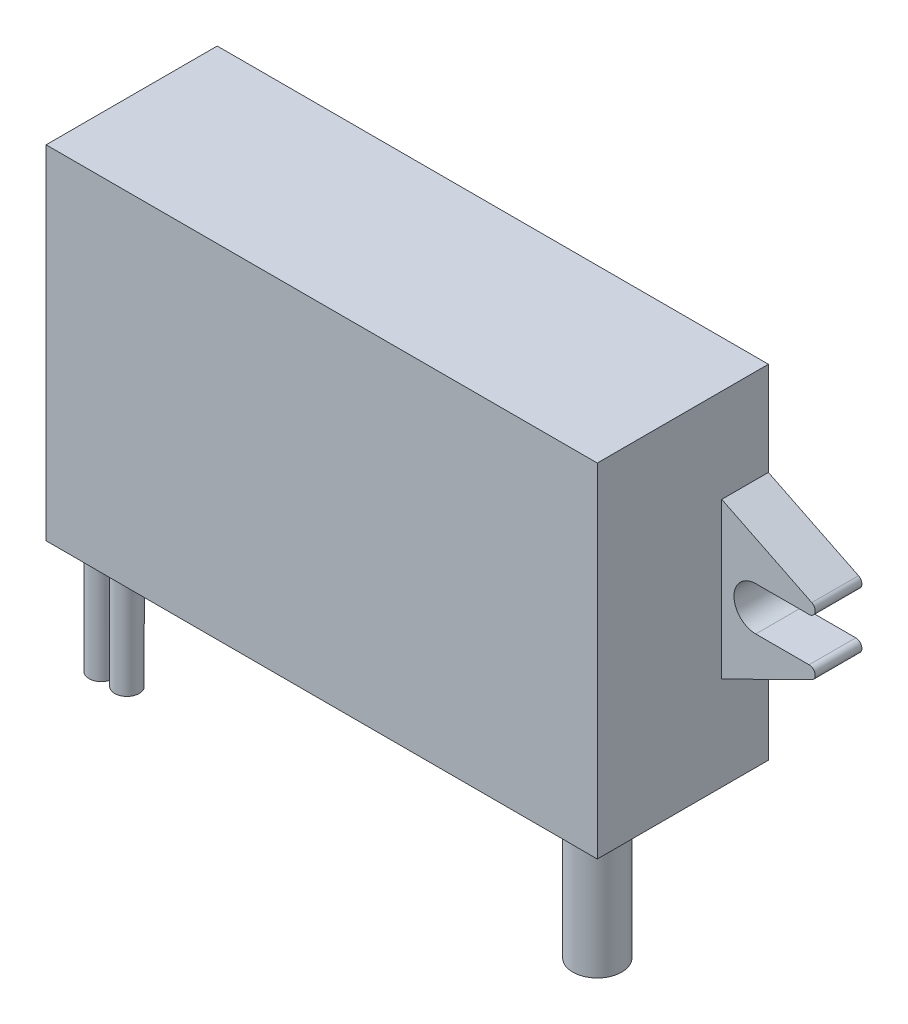
ISO-10303-21;
HEADER;
FILE_DESCRIPTION(('STEP AP214'),'2;1');
FILE_NAME('part.step','',(''),(''),'','','');
FILE_SCHEMA(('AUTOMOTIVE_DESIGN { 1 0 10303 214 1 1 1 1 }'));
ENDSEC;
DATA;
#1=APPLICATION_CONTEXT('core data for automotive mechanical design processes');
#2=APPLICATION_PROTOCOL_DEFINITION('international standard','automotive_design',2000,#1);
#3=PRODUCT_CONTEXT('',#1,'mechanical');
#4=PRODUCT('Part','Part','',(#3));
#5=PRODUCT_RELATED_PRODUCT_CATEGORY('part','',(#4));
#6=PRODUCT_DEFINITION_FORMATION('','',#4);
#7=PRODUCT_DEFINITION_CONTEXT('part definition',#1,'design');
#8=PRODUCT_DEFINITION('design','',#6,#7);
#9=PRODUCT_DEFINITION_SHAPE('','',#8);
#10=(LENGTH_UNIT() NAMED_UNIT(*) SI_UNIT(.MILLI.,.METRE.));
#11=(NAMED_UNIT(*) PLANE_ANGLE_UNIT() SI_UNIT($,.RADIAN.));
#12=(NAMED_UNIT(*) SI_UNIT($,.STERADIAN.) SOLID_ANGLE_UNIT());
#13=UNCERTAINTY_MEASURE_WITH_UNIT(LENGTH_MEASURE(1.E-05),#10,'distance_accuracy_value','');
#14=(GEOMETRIC_REPRESENTATION_CONTEXT(3) GLOBAL_UNCERTAINTY_ASSIGNED_CONTEXT((#13)) GLOBAL_UNIT_ASSIGNED_CONTEXT((#10,
#11,#12)) REPRESENTATION_CONTEXT('',''));
#15=CARTESIAN_POINT('',(0.,0.,0.));
#16=DIRECTION('',(0.,0.,1.));
#17=DIRECTION('',(1.,0.,0.));
#18=AXIS2_PLACEMENT_3D('',#15,#16,#17);
#19=CARTESIAN_POINT('',(-22.5,14.,13.97));
#20=DIRECTION('',(1.,0.,0.));
#21=DIRECTION('',(0.,0.,-1.));
#22=AXIS2_PLACEMENT_3D('',#19,#20,#21);
#23=PLANE('',#22);
#24=DIRECTION('',(0.,0.,-1.));
#25=VECTOR('',#24,1.);
#26=CARTESIAN_POINT('',(-22.5,6.35,3.81));
#27=LINE('',#26,#25);
#28=CARTESIAN_POINT('',(-22.5,6.35,3.81));
#29=VERTEX_POINT('',#28);
#30=CARTESIAN_POINT('',(-22.5,6.35,0.));
#31=VERTEX_POINT('',#30);
#32=EDGE_CURVE('E202',#29,#31,#27,.T.);
#33=ORIENTED_EDGE('',*,*,#32,.F.);
#34=DIRECTION('',(0.,1.,0.));
#35=VECTOR('',#34,1.);
#36=CARTESIAN_POINT('',(-22.5,-6.35,3.81));
#37=LINE('',#36,#35);
#38=CARTESIAN_POINT('',(-22.5,-6.35,3.81));
#39=VERTEX_POINT('',#38);
#40=EDGE_CURVE('E187',#39,#29,#37,.T.);
#41=ORIENTED_EDGE('',*,*,#40,.F.);
#42=DIRECTION('',(0.,0.,-1.));
#43=VECTOR('',#42,1.);
#44=CARTESIAN_POINT('',(-22.5,-6.35,3.81));
#45=LINE('',#44,#43);
#46=CARTESIAN_POINT('',(-22.5,-6.35,0.));
#47=VERTEX_POINT('',#46);
#48=EDGE_CURVE('E193',#39,#47,#45,.T.);
#49=ORIENTED_EDGE('',*,*,#48,.T.);
#50=DIRECTION('',(0.,-1.,0.));
#51=VECTOR('',#50,1.);
#52=CARTESIAN_POINT('',(-22.5,14.,0.));
#53=LINE('',#52,#51);
#54=CARTESIAN_POINT('',(-22.5,-14.,0.));
#55=VERTEX_POINT('',#54);
#56=EDGE_CURVE('E325',#47,#55,#53,.T.);
#57=ORIENTED_EDGE('',*,*,#56,.T.);
#58=DIRECTION('',(0.,0.,-1.));
#59=VECTOR('',#58,1.);
#60=CARTESIAN_POINT('',(-22.5,-14.,13.97));
#61=LINE('',#60,#59);
#62=CARTESIAN_POINT('',(-22.5,-14.,13.97));
#63=VERTEX_POINT('',#62);
#64=EDGE_CURVE('E331',#63,#55,#61,.T.);
#65=ORIENTED_EDGE('',*,*,#64,.F.);
#66=DIRECTION('',(0.,-1.,0.));
#67=VECTOR('',#66,1.);
#68=CARTESIAN_POINT('',(-22.5,14.,13.97));
#69=LINE('',#68,#67);
#70=CARTESIAN_POINT('',(-22.5,14.,13.97));
#71=VERTEX_POINT('',#70);
#72=EDGE_CURVE('E315',#71,#63,#69,.T.);
#73=ORIENTED_EDGE('',*,*,#72,.F.);
#74=DIRECTION('',(0.,0.,-1.));
#75=VECTOR('',#74,1.);
#76=CARTESIAN_POINT('',(-22.5,14.,13.97));
#77=LINE('',#76,#75);
#78=CARTESIAN_POINT('',(-22.5,14.,0.));
#79=VERTEX_POINT('',#78);
#80=EDGE_CURVE('E334',#71,#79,#77,.T.);
#81=ORIENTED_EDGE('',*,*,#80,.T.);
#82=EDGE_CURVE('E326',#79,#31,#53,.T.);
#83=ORIENTED_EDGE('',*,*,#82,.T.);
#84=EDGE_LOOP('',(#33,#41,#49,#57,#65,#73,#81,#83));
#85=FACE_BOUND('',#84,.T.);
#86=ADVANCED_FACE('F45',(#85),#23,.F.);
#87=CARTESIAN_POINT('',(22.5,14.,13.97));
#88=DIRECTION('',(-1.,0.,0.));
#89=DIRECTION('',(0.,-1.,0.));
#90=AXIS2_PLACEMENT_3D('',#87,#88,#89);
#91=PLANE('',#90);
#92=DIRECTION('',(0.,0.,-1.));
#93=VECTOR('',#92,1.);
#94=CARTESIAN_POINT('',(22.5,-6.35,3.81));
#95=LINE('',#94,#93);
#96=CARTESIAN_POINT('',(22.5,-6.35,3.81));
#97=VERTEX_POINT('',#96);
#98=CARTESIAN_POINT('',(22.5,-6.35,0.));
#99=VERTEX_POINT('',#98);
#100=EDGE_CURVE('E293',#97,#99,#95,.T.);
#101=ORIENTED_EDGE('',*,*,#100,.F.);
#102=DIRECTION('',(0.,1.,0.));
#103=VECTOR('',#102,1.);
#104=CARTESIAN_POINT('',(22.5,-6.35,3.81));
#105=LINE('',#104,#103);
#106=CARTESIAN_POINT('',(22.5,6.35,3.81));
#107=VERTEX_POINT('',#106);
#108=EDGE_CURVE('E249',#97,#107,#105,.T.);
#109=ORIENTED_EDGE('',*,*,#108,.T.);
#110=DIRECTION('',(0.,0.,-1.));
#111=VECTOR('',#110,1.);
#112=CARTESIAN_POINT('',(22.5,6.35,3.81));
#113=LINE('',#112,#111);
#114=CARTESIAN_POINT('',(22.5,6.35,0.));
#115=VERTEX_POINT('',#114);
#116=EDGE_CURVE('E274',#107,#115,#113,.T.);
#117=ORIENTED_EDGE('',*,*,#116,.T.);
#118=DIRECTION('',(0.,1.,0.));
#119=VECTOR('',#118,1.);
#120=CARTESIAN_POINT('',(22.5,14.,0.));
#121=LINE('',#120,#119);
#122=CARTESIAN_POINT('',(22.5,14.,0.));
#123=VERTEX_POINT('',#122);
#124=EDGE_CURVE('E295',#115,#123,#121,.T.);
#125=ORIENTED_EDGE('',*,*,#124,.T.);
#126=DIRECTION('',(0.,0.,-1.));
#127=VECTOR('',#126,1.);
#128=CARTESIAN_POINT('',(22.5,14.,13.97));
#129=LINE('',#128,#127);
#130=CARTESIAN_POINT('',(22.5,14.,13.97));
#131=VERTEX_POINT('',#130);
#132=EDGE_CURVE('E337',#131,#123,#129,.T.);
#133=ORIENTED_EDGE('',*,*,#132,.F.);
#134=DIRECTION('',(0.,1.,0.));
#135=VECTOR('',#134,1.);
#136=CARTESIAN_POINT('',(22.5,14.,13.97));
#137=LINE('',#136,#135);
#138=CARTESIAN_POINT('',(22.5,-14.,13.97));
#139=VERTEX_POINT('',#138);
#140=EDGE_CURVE('E309',#139,#131,#137,.T.);
#141=ORIENTED_EDGE('',*,*,#140,.F.);
#142=DIRECTION('',(0.,0.,-1.));
#143=VECTOR('',#142,1.);
#144=CARTESIAN_POINT('',(22.5,-14.,13.97));
#145=LINE('',#144,#143);
#146=CARTESIAN_POINT('',(22.5,-14.,0.));
#147=VERTEX_POINT('',#146);
#148=EDGE_CURVE('E319',#139,#147,#145,.T.);
#149=ORIENTED_EDGE('',*,*,#148,.T.);
#150=EDGE_CURVE('E320',#147,#99,#121,.T.);
#151=ORIENTED_EDGE('',*,*,#150,.T.);
#152=EDGE_LOOP('',(#101,#109,#117,#125,#133,#141,#149,#151));
#153=FACE_BOUND('',#152,.T.);
#154=ADVANCED_FACE('F47',(#153),#91,.F.);
#155=CARTESIAN_POINT('',(-22.5,14.,13.97));
#156=DIRECTION('',(0.,-1.,0.));
#157=DIRECTION('',(0.,0.,-1.));
#158=AXIS2_PLACEMENT_3D('',#155,#156,#157);
#159=PLANE('',#158);
#160=DIRECTION('',(-1.,0.,0.));
#161=VECTOR('',#160,1.);
#162=CARTESIAN_POINT('',(-22.5,14.,0.));
#163=LINE('',#162,#161);
#164=EDGE_CURVE('E323',#123,#79,#163,.T.);
#165=ORIENTED_EDGE('',*,*,#164,.T.);
#166=ORIENTED_EDGE('',*,*,#80,.F.);
#167=DIRECTION('',(-1.,0.,0.));
#168=VECTOR('',#167,1.);
#169=CARTESIAN_POINT('',(-22.5,14.,13.97));
#170=LINE('',#169,#168);
#171=EDGE_CURVE('E312',#131,#71,#170,.T.);
#172=ORIENTED_EDGE('',*,*,#171,.F.);
#173=ORIENTED_EDGE('',*,*,#132,.T.);
#174=EDGE_LOOP('',(#165,#166,#172,#173));
#175=FACE_BOUND('',#174,.T.);
#176=ADVANCED_FACE('F351',(#175),#159,.F.);
#177=CARTESIAN_POINT('',(-22.5,-14.,13.97));
#178=DIRECTION('',(0.,1.,0.));
#179=DIRECTION('',(0.,0.,1.));
#180=AXIS2_PLACEMENT_3D('',#177,#178,#179);
#181=PLANE('',#180);
#182=CARTESIAN_POINT('',(-21.,-14.,10.97));
#183=DIRECTION('',(0.,1.,0.));
#184=DIRECTION('',(0.,0.,1.));
#185=AXIS2_PLACEMENT_3D('',#182,#183,#184);
#186=CIRCLE('',#185,1.);
#187=CARTESIAN_POINT('',(-21.,-14.,11.97));
#188=VERTEX_POINT('',#187);
#189=EDGE_CURVE('E11',#188,#188,#186,.F.);
#190=ORIENTED_EDGE('',*,*,#189,.F.);
#191=EDGE_LOOP('',(#190));
#192=FACE_BOUND('',#191,.T.);
#193=CARTESIAN_POINT('',(-18.9,-14.,10.97));
#194=DIRECTION('',(0.,1.,0.));
#195=DIRECTION('',(0.,0.,1.));
#196=AXIS2_PLACEMENT_3D('',#193,#194,#195);
#197=CIRCLE('',#196,1.);
#198=CARTESIAN_POINT('',(-18.9,-14.,11.97));
#199=VERTEX_POINT('',#198);
#200=EDGE_CURVE('E53',#199,#199,#197,.F.);
#201=ORIENTED_EDGE('',*,*,#200,.F.);
#202=EDGE_LOOP('',(#201));
#203=FACE_BOUND('',#202,.T.);
#204=CARTESIAN_POINT('',(19.5,-14.,10.97));
#205=DIRECTION('',(0.,1.,0.));
#206=DIRECTION('',(0.,0.,1.));
#207=AXIS2_PLACEMENT_3D('',#204,#205,#206);
#208=CIRCLE('',#207,2.);
#209=CARTESIAN_POINT('',(19.5,-14.,12.97));
#210=VERTEX_POINT('',#209);
#211=EDGE_CURVE('E340',#210,#210,#208,.F.);
#212=ORIENTED_EDGE('',*,*,#211,.F.);
#213=EDGE_LOOP('',(#212));
#214=FACE_BOUND('',#213,.T.);
#215=DIRECTION('',(1.,0.,0.));
#216=VECTOR('',#215,1.);
#217=CARTESIAN_POINT('',(-22.5,-14.,0.));
#218=LINE('',#217,#216);
#219=EDGE_CURVE('E313',#55,#147,#218,.T.);
#220=ORIENTED_EDGE('',*,*,#219,.T.);
#221=ORIENTED_EDGE('',*,*,#148,.F.);
#222=DIRECTION('',(1.,0.,0.));
#223=VECTOR('',#222,1.);
#224=CARTESIAN_POINT('',(-22.5,-14.,13.97));
#225=LINE('',#224,#223);
#226=EDGE_CURVE('E317',#63,#139,#225,.T.);
#227=ORIENTED_EDGE('',*,*,#226,.F.);
#228=ORIENTED_EDGE('',*,*,#64,.T.);
#229=EDGE_LOOP('',(#220,#221,#227,#228));
#230=FACE_BOUND('',#229,.T.);
#231=ADVANCED_FACE('F347',(#192,#203,#214,#230),#181,.F.);
#232=CARTESIAN_POINT('',(0.,0.,13.97));
#233=DIRECTION('',(0.,0.,1.));
#234=DIRECTION('',(1.,0.,0.));
#235=AXIS2_PLACEMENT_3D('',#232,#233,#234);
#236=PLANE('',#235);
#237=ORIENTED_EDGE('',*,*,#140,.T.);
#238=ORIENTED_EDGE('',*,*,#171,.T.);
#239=ORIENTED_EDGE('',*,*,#72,.T.);
#240=ORIENTED_EDGE('',*,*,#226,.T.);
#241=EDGE_LOOP('',(#237,#238,#239,#240));
#242=FACE_BOUND('',#241,.T.);
#243=ADVANCED_FACE('F350',(#242),#236,.T.);
#244=CARTESIAN_POINT('',(0.,0.,0.));
#245=DIRECTION('',(0.,0.,1.));
#246=DIRECTION('',(1.,0.,0.));
#247=AXIS2_PLACEMENT_3D('',#244,#245,#246);
#248=PLANE('',#247);
#249=ORIENTED_EDGE('',*,*,#150,.F.);
#250=ORIENTED_EDGE('',*,*,#219,.F.);
#251=ORIENTED_EDGE('',*,*,#56,.F.);
#252=DIRECTION('',(0.897023640674487,-0.441982565347422,0.));
#253=VECTOR('',#252,1.);
#254=CARTESIAN_POINT('',(-29.8540334250676,-2.72651182033722,0.));
#255=LINE('',#254,#253);
#256=CARTESIAN_POINT('',(-29.8540334250676,-2.72651182033722,0.));
#257=VERTEX_POINT('',#256);
#258=EDGE_CURVE('E60',#257,#47,#255,.T.);
#259=ORIENTED_EDGE('',*,*,#258,.F.);
#260=CARTESIAN_POINT('',(-29.6330421423939,-2.27799999999999,0.));
#261=DIRECTION('',(0.,0.,1.));
#262=DIRECTION('',(1.,0.,0.));
#263=AXIS2_PLACEMENT_3D('',#260,#261,#262);
#264=CIRCLE('',#263,0.499999999999986);
#265=CARTESIAN_POINT('',(-29.6330421423939,-1.778,0.));
#266=VERTEX_POINT('',#265);
#267=EDGE_CURVE('E222',#266,#257,#264,.T.);
#268=ORIENTED_EDGE('',*,*,#267,.F.);
#269=DIRECTION('',(-1.,0.,0.));
#270=VECTOR('',#269,1.);
#271=CARTESIAN_POINT('',(-25.278,-1.778,0.));
#272=LINE('',#271,#270);
#273=CARTESIAN_POINT('',(-25.278,-1.778,0.));
#274=VERTEX_POINT('',#273);
#275=EDGE_CURVE('E225',#274,#266,#272,.T.);
#276=ORIENTED_EDGE('',*,*,#275,.F.);
#277=CARTESIAN_POINT('',(-25.278,0.,0.));
#278=DIRECTION('',(0.,0.,-1.));
#279=DIRECTION('',(-1.,0.,0.));
#280=AXIS2_PLACEMENT_3D('',#277,#278,#279);
#281=CIRCLE('',#280,1.778);
#282=CARTESIAN_POINT('',(-25.278,1.778,0.));
#283=VERTEX_POINT('',#282);
#284=EDGE_CURVE('E227',#283,#274,#281,.T.);
#285=ORIENTED_EDGE('',*,*,#284,.F.);
#286=DIRECTION('',(1.,0.,0.));
#287=VECTOR('',#286,1.);
#288=CARTESIAN_POINT('',(-29.6330421423939,1.778,0.));
#289=LINE('',#288,#287);
#290=CARTESIAN_POINT('',(-29.6330421423939,1.778,0.));
#291=VERTEX_POINT('',#290);
#292=EDGE_CURVE('E229',#291,#283,#289,.T.);
#293=ORIENTED_EDGE('',*,*,#292,.F.);
#294=CARTESIAN_POINT('',(-29.6330421423939,2.27799999999999,0.));
#295=DIRECTION('',(0.,0.,1.));
#296=DIRECTION('',(1.,0.,0.));
#297=AXIS2_PLACEMENT_3D('',#294,#295,#296);
#298=CIRCLE('',#297,0.499999999999987);
#299=CARTESIAN_POINT('',(-29.8540334250676,2.72651182033722,0.));
#300=VERTEX_POINT('',#299);
#301=EDGE_CURVE('E205',#300,#291,#298,.T.);
#302=ORIENTED_EDGE('',*,*,#301,.F.);
#303=DIRECTION('',(-0.897023640674487,-0.441982565347423,0.));
#304=VECTOR('',#303,1.);
#305=CARTESIAN_POINT('',(-22.5,6.35,0.));
#306=LINE('',#305,#304);
#307=EDGE_CURVE('E203',#31,#300,#306,.T.);
#308=ORIENTED_EDGE('',*,*,#307,.F.);
#309=ORIENTED_EDGE('',*,*,#82,.F.);
#310=ORIENTED_EDGE('',*,*,#164,.F.);
#311=ORIENTED_EDGE('',*,*,#124,.F.);
#312=DIRECTION('',(0.897023640674487,-0.441982565347423,0.));
#313=VECTOR('',#312,1.);
#314=CARTESIAN_POINT('',(22.5,6.35,0.));
#315=LINE('',#314,#313);
#316=CARTESIAN_POINT('',(29.8540334250676,2.72651182033722,0.));
#317=VERTEX_POINT('',#316);
#318=EDGE_CURVE('E68',#115,#317,#315,.T.);
#319=ORIENTED_EDGE('',*,*,#318,.T.);
#320=CARTESIAN_POINT('',(29.6330421423939,2.27799999999999,0.));
#321=DIRECTION('',(0.,0.,-1.));
#322=DIRECTION('',(-1.,0.,0.));
#323=AXIS2_PLACEMENT_3D('',#320,#321,#322);
#324=CIRCLE('',#323,0.499999999999987);
#325=CARTESIAN_POINT('',(29.6330421423939,1.778,0.));
#326=VERTEX_POINT('',#325);
#327=EDGE_CURVE('E276',#317,#326,#324,.T.);
#328=ORIENTED_EDGE('',*,*,#327,.T.);
#329=DIRECTION('',(-1.,0.,0.));
#330=VECTOR('',#329,1.);
#331=CARTESIAN_POINT('',(29.6330421423939,1.778,0.));
#332=LINE('',#331,#330);
#333=CARTESIAN_POINT('',(25.278,1.778,0.));
#334=VERTEX_POINT('',#333);
#335=EDGE_CURVE('E279',#326,#334,#332,.T.);
#336=ORIENTED_EDGE('',*,*,#335,.T.);
#337=CARTESIAN_POINT('',(25.278,0.,0.));
#338=DIRECTION('',(0.,0.,1.));
#339=DIRECTION('',(1.,0.,0.));
#340=AXIS2_PLACEMENT_3D('',#337,#338,#339);
#341=CIRCLE('',#340,1.778);
#342=CARTESIAN_POINT('',(25.278,-1.778,0.));
#343=VERTEX_POINT('',#342);
#344=EDGE_CURVE('E282',#334,#343,#341,.T.);
#345=ORIENTED_EDGE('',*,*,#344,.T.);
#346=DIRECTION('',(1.,0.,0.));
#347=VECTOR('',#346,1.);
#348=CARTESIAN_POINT('',(25.278,-1.778,0.));
#349=LINE('',#348,#347);
#350=CARTESIAN_POINT('',(29.6330421423939,-1.778,0.));
#351=VERTEX_POINT('',#350);
#352=EDGE_CURVE('E285',#343,#351,#349,.T.);
#353=ORIENTED_EDGE('',*,*,#352,.T.);
#354=CARTESIAN_POINT('',(29.6330421423939,-2.27799999999999,0.));
#355=DIRECTION('',(0.,0.,-1.));
#356=DIRECTION('',(-1.,0.,0.));
#357=AXIS2_PLACEMENT_3D('',#354,#355,#356);
#358=CIRCLE('',#357,0.499999999999986);
#359=CARTESIAN_POINT('',(29.8540334250676,-2.72651182033722,0.));
#360=VERTEX_POINT('',#359);
#361=EDGE_CURVE('E288',#351,#360,#358,.T.);
#362=ORIENTED_EDGE('',*,*,#361,.T.);
#363=DIRECTION('',(-0.897023640674487,-0.441982565347422,0.));
#364=VECTOR('',#363,1.);
#365=CARTESIAN_POINT('',(29.8540334250676,-2.72651182033722,0.));
#366=LINE('',#365,#364);
#367=EDGE_CURVE('E253',#360,#99,#366,.T.);
#368=ORIENTED_EDGE('',*,*,#367,.T.);
#369=EDGE_LOOP('',(#249,#250,#251,#259,#268,#276,#285,#293,#302,#308,#309,#310,#311,#319,#328,
#336,#345,#353,#362,#368));
#370=FACE_BOUND('',#369,.T.);
#371=ADVANCED_FACE('F366',(#370),#248,.F.);
#372=CARTESIAN_POINT('',(29.8540334250676,-2.72651182033722,3.81));
#373=DIRECTION('',(0.441982565347422,-0.897023640674487,0.));
#374=DIRECTION('',(0.897023640674487,0.441982565347422,0.));
#375=AXIS2_PLACEMENT_3D('',#372,#373,#374);
#376=PLANE('',#375);
#377=ORIENTED_EDGE('',*,*,#367,.F.);
#378=DIRECTION('',(0.,0.,-1.));
#379=VECTOR('',#378,1.);
#380=CARTESIAN_POINT('',(29.8540334250676,-2.72651182033722,3.81));
#381=LINE('',#380,#379);
#382=CARTESIAN_POINT('',(29.8540334250676,-2.72651182033722,3.81));
#383=VERTEX_POINT('',#382);
#384=EDGE_CURVE('E296',#383,#360,#381,.T.);
#385=ORIENTED_EDGE('',*,*,#384,.F.);
#386=DIRECTION('',(-0.897023640674487,-0.441982565347422,0.));
#387=VECTOR('',#386,1.);
#388=CARTESIAN_POINT('',(29.8540334250676,-2.72651182033722,3.81));
#389=LINE('',#388,#387);
#390=EDGE_CURVE('E271',#383,#97,#389,.T.);
#391=ORIENTED_EDGE('',*,*,#390,.T.);
#392=ORIENTED_EDGE('',*,*,#100,.T.);
#393=EDGE_LOOP('',(#377,#385,#391,#392));
#394=FACE_BOUND('',#393,.T.);
#395=ADVANCED_FACE('F370',(#394),#376,.T.);
#396=CARTESIAN_POINT('',(29.6330421423939,-2.27799999999999,3.81));
#397=DIRECTION('',(0.,0.,-1.));
#398=DIRECTION('',(-1.,0.,0.));
#399=AXIS2_PLACEMENT_3D('',#396,#397,#398);
#400=CYLINDRICAL_SURFACE('',#399,0.499999999999986);
#401=ORIENTED_EDGE('',*,*,#361,.F.);
#402=DIRECTION('',(0.,0.,-1.));
#403=VECTOR('',#402,1.);
#404=CARTESIAN_POINT('',(29.6330421423939,-1.778,3.81));
#405=LINE('',#404,#403);
#406=CARTESIAN_POINT('',(29.6330421423939,-1.778,3.81));
#407=VERTEX_POINT('',#406);
#408=EDGE_CURVE('E298',#407,#351,#405,.T.);
#409=ORIENTED_EDGE('',*,*,#408,.F.);
#410=CARTESIAN_POINT('',(29.6330421423939,-2.27799999999999,3.81));
#411=DIRECTION('',(0.,0.,-1.));
#412=DIRECTION('',(-1.,0.,0.));
#413=AXIS2_PLACEMENT_3D('',#410,#411,#412);
#414=CIRCLE('',#413,0.499999999999986);
#415=EDGE_CURVE('E268',#407,#383,#414,.T.);
#416=ORIENTED_EDGE('',*,*,#415,.T.);
#417=ORIENTED_EDGE('',*,*,#384,.T.);
#418=EDGE_LOOP('',(#401,#409,#416,#417));
#419=FACE_BOUND('',#418,.T.);
#420=ADVANCED_FACE('F457',(#419),#400,.T.);
#421=CARTESIAN_POINT('',(25.278,-1.778,3.81));
#422=DIRECTION('',(0.,1.,0.));
#423=DIRECTION('',(-1.,0.,0.));
#424=AXIS2_PLACEMENT_3D('',#421,#422,#423);
#425=PLANE('',#424);
#426=ORIENTED_EDGE('',*,*,#352,.F.);
#427=DIRECTION('',(0.,0.,-1.));
#428=VECTOR('',#427,1.);
#429=CARTESIAN_POINT('',(25.278,-1.778,3.81));
#430=LINE('',#429,#428);
#431=CARTESIAN_POINT('',(25.278,-1.778,3.81));
#432=VERTEX_POINT('',#431);
#433=EDGE_CURVE('E300',#432,#343,#430,.T.);
#434=ORIENTED_EDGE('',*,*,#433,.F.);
#435=DIRECTION('',(1.,0.,0.));
#436=VECTOR('',#435,1.);
#437=CARTESIAN_POINT('',(25.278,-1.778,3.81));
#438=LINE('',#437,#436);
#439=EDGE_CURVE('E265',#432,#407,#438,.T.);
#440=ORIENTED_EDGE('',*,*,#439,.T.);
#441=ORIENTED_EDGE('',*,*,#408,.T.);
#442=EDGE_LOOP('',(#426,#434,#440,#441));
#443=FACE_BOUND('',#442,.T.);
#444=ADVANCED_FACE('F465',(#443),#425,.T.);
#445=CARTESIAN_POINT('',(25.278,0.,3.81));
#446=DIRECTION('',(0.,0.,-1.));
#447=DIRECTION('',(-1.,0.,0.));
#448=AXIS2_PLACEMENT_3D('',#445,#446,#447);
#449=CYLINDRICAL_SURFACE('',#448,1.778);
#450=ORIENTED_EDGE('',*,*,#344,.F.);
#451=DIRECTION('',(0.,0.,-1.));
#452=VECTOR('',#451,1.);
#453=CARTESIAN_POINT('',(25.278,1.778,3.81));
#454=LINE('',#453,#452);
#455=CARTESIAN_POINT('',(25.278,1.778,3.81));
#456=VERTEX_POINT('',#455);
#457=EDGE_CURVE('E302',#456,#334,#454,.T.);
#458=ORIENTED_EDGE('',*,*,#457,.F.);
#459=CARTESIAN_POINT('',(25.278,0.,3.81));
#460=DIRECTION('',(0.,0.,1.));
#461=DIRECTION('',(1.,0.,0.));
#462=AXIS2_PLACEMENT_3D('',#459,#460,#461);
#463=CIRCLE('',#462,1.778);
#464=EDGE_CURVE('E262',#456,#432,#463,.T.);
#465=ORIENTED_EDGE('',*,*,#464,.T.);
#466=ORIENTED_EDGE('',*,*,#433,.T.);
#467=EDGE_LOOP('',(#450,#458,#465,#466));
#468=FACE_BOUND('',#467,.T.);
#469=ADVANCED_FACE('F474',(#468),#449,.F.);
#470=CARTESIAN_POINT('',(29.6330421423939,1.778,3.81));
#471=DIRECTION('',(0.,-1.,0.));
#472=DIRECTION('',(1.,0.,0.));
#473=AXIS2_PLACEMENT_3D('',#470,#471,#472);
#474=PLANE('',#473);
#475=ORIENTED_EDGE('',*,*,#335,.F.);
#476=DIRECTION('',(0.,0.,-1.));
#477=VECTOR('',#476,1.);
#478=CARTESIAN_POINT('',(29.6330421423939,1.778,3.81));
#479=LINE('',#478,#477);
#480=CARTESIAN_POINT('',(29.6330421423939,1.778,3.81));
#481=VERTEX_POINT('',#480);
#482=EDGE_CURVE('E304',#481,#326,#479,.T.);
#483=ORIENTED_EDGE('',*,*,#482,.F.);
#484=DIRECTION('',(-1.,0.,0.));
#485=VECTOR('',#484,1.);
#486=CARTESIAN_POINT('',(29.6330421423939,1.778,3.81));
#487=LINE('',#486,#485);
#488=EDGE_CURVE('E259',#481,#456,#487,.T.);
#489=ORIENTED_EDGE('',*,*,#488,.T.);
#490=ORIENTED_EDGE('',*,*,#457,.T.);
#491=EDGE_LOOP('',(#475,#483,#489,#490));
#492=FACE_BOUND('',#491,.T.);
#493=ADVANCED_FACE('F483',(#492),#474,.T.);
#494=CARTESIAN_POINT('',(29.6330421423939,2.27799999999999,3.81));
#495=DIRECTION('',(0.,0.,-1.));
#496=DIRECTION('',(-1.,0.,0.));
#497=AXIS2_PLACEMENT_3D('',#494,#495,#496);
#498=CYLINDRICAL_SURFACE('',#497,0.499999999999987);
#499=ORIENTED_EDGE('',*,*,#327,.F.);
#500=DIRECTION('',(0.,0.,-1.));
#501=VECTOR('',#500,1.);
#502=CARTESIAN_POINT('',(29.8540334250676,2.72651182033722,3.81));
#503=LINE('',#502,#501);
#504=CARTESIAN_POINT('',(29.8540334250676,2.72651182033722,3.81));
#505=VERTEX_POINT('',#504);
#506=EDGE_CURVE('E306',#505,#317,#503,.T.);
#507=ORIENTED_EDGE('',*,*,#506,.F.);
#508=CARTESIAN_POINT('',(29.6330421423939,2.27799999999999,3.81));
#509=DIRECTION('',(0.,0.,-1.));
#510=DIRECTION('',(-1.,0.,0.));
#511=AXIS2_PLACEMENT_3D('',#508,#509,#510);
#512=CIRCLE('',#511,0.499999999999987);
#513=EDGE_CURVE('E256',#505,#481,#512,.T.);
#514=ORIENTED_EDGE('',*,*,#513,.T.);
#515=ORIENTED_EDGE('',*,*,#482,.T.);
#516=EDGE_LOOP('',(#499,#507,#514,#515));
#517=FACE_BOUND('',#516,.T.);
#518=ADVANCED_FACE('F382',(#517),#498,.T.);
#519=CARTESIAN_POINT('',(22.5,6.35,3.81));
#520=DIRECTION('',(0.441982565347423,0.897023640674487,0.));
#521=DIRECTION('',(-0.897023640674487,0.441982565347423,0.));
#522=AXIS2_PLACEMENT_3D('',#519,#520,#521);
#523=PLANE('',#522);
#524=ORIENTED_EDGE('',*,*,#318,.F.);
#525=ORIENTED_EDGE('',*,*,#116,.F.);
#526=DIRECTION('',(0.897023640674487,-0.441982565347423,0.));
#527=VECTOR('',#526,1.);
#528=CARTESIAN_POINT('',(22.5,6.35,3.81));
#529=LINE('',#528,#527);
#530=EDGE_CURVE('E252',#107,#505,#529,.T.);
#531=ORIENTED_EDGE('',*,*,#530,.T.);
#532=ORIENTED_EDGE('',*,*,#506,.T.);
#533=EDGE_LOOP('',(#524,#525,#531,#532));
#534=FACE_BOUND('',#533,.T.);
#535=ADVANCED_FACE('F379',(#534),#523,.T.);
#536=CARTESIAN_POINT('',(29.6330421423939,2.27799999999999,3.81));
#537=DIRECTION('',(0.,0.,-1.));
#538=DIRECTION('',(-1.,0.,0.));
#539=AXIS2_PLACEMENT_3D('',#536,#537,#538);
#540=PLANE('',#539);
#541=ORIENTED_EDGE('',*,*,#108,.F.);
#542=ORIENTED_EDGE('',*,*,#390,.F.);
#543=ORIENTED_EDGE('',*,*,#415,.F.);
#544=ORIENTED_EDGE('',*,*,#439,.F.);
#545=ORIENTED_EDGE('',*,*,#464,.F.);
#546=ORIENTED_EDGE('',*,*,#488,.F.);
#547=ORIENTED_EDGE('',*,*,#513,.F.);
#548=ORIENTED_EDGE('',*,*,#530,.F.);
#549=EDGE_LOOP('',(#541,#542,#543,#544,#545,#546,#547,#548));
#550=FACE_BOUND('',#549,.T.);
#551=ADVANCED_FACE('F375',(#550),#540,.F.);
#552=CARTESIAN_POINT('',(-22.5,6.35,3.81));
#553=DIRECTION('',(0.441982565347423,-0.897023640674487,0.));
#554=DIRECTION('',(0.897023640674487,0.441982565347423,0.));
#555=AXIS2_PLACEMENT_3D('',#552,#553,#554);
#556=PLANE('',#555);
#557=ORIENTED_EDGE('',*,*,#307,.T.);
#558=DIRECTION('',(0.,0.,-1.));
#559=VECTOR('',#558,1.);
#560=CARTESIAN_POINT('',(-29.8540334250676,2.72651182033722,3.81));
#561=LINE('',#560,#559);
#562=CARTESIAN_POINT('',(-29.8540334250676,2.72651182033722,3.81));
#563=VERTEX_POINT('',#562);
#564=EDGE_CURVE('E233',#563,#300,#561,.T.);
#565=ORIENTED_EDGE('',*,*,#564,.F.);
#566=DIRECTION('',(-0.897023640674487,-0.441982565347423,0.));
#567=VECTOR('',#566,1.);
#568=CARTESIAN_POINT('',(-22.5,6.35,3.81));
#569=LINE('',#568,#567);
#570=EDGE_CURVE('E198',#29,#563,#569,.T.);
#571=ORIENTED_EDGE('',*,*,#570,.F.);
#572=ORIENTED_EDGE('',*,*,#32,.T.);
#573=EDGE_LOOP('',(#557,#565,#571,#572));
#574=FACE_BOUND('',#573,.T.);
#575=ADVANCED_FACE('F415',(#574),#556,.F.);
#576=CARTESIAN_POINT('',(-29.6330421423939,2.27799999999999,3.81));
#577=DIRECTION('',(0.,0.,-1.));
#578=DIRECTION('',(-1.,0.,0.));
#579=AXIS2_PLACEMENT_3D('',#576,#577,#578);
#580=CYLINDRICAL_SURFACE('',#579,0.499999999999987);
#581=ORIENTED_EDGE('',*,*,#301,.T.);
#582=DIRECTION('',(0.,0.,-1.));
#583=VECTOR('',#582,1.);
#584=CARTESIAN_POINT('',(-29.6330421423939,1.778,3.81));
#585=LINE('',#584,#583);
#586=CARTESIAN_POINT('',(-29.6330421423939,1.778,3.81));
#587=VERTEX_POINT('',#586);
#588=EDGE_CURVE('E236',#587,#291,#585,.T.);
#589=ORIENTED_EDGE('',*,*,#588,.F.);
#590=CARTESIAN_POINT('',(-29.6330421423939,2.27799999999999,3.81));
#591=DIRECTION('',(0.,0.,1.));
#592=DIRECTION('',(1.,0.,0.));
#593=AXIS2_PLACEMENT_3D('',#590,#591,#592);
#594=CIRCLE('',#593,0.499999999999987);
#595=EDGE_CURVE('E218',#563,#587,#594,.T.);
#596=ORIENTED_EDGE('',*,*,#595,.F.);
#597=ORIENTED_EDGE('',*,*,#564,.T.);
#598=EDGE_LOOP('',(#581,#589,#596,#597));
#599=FACE_BOUND('',#598,.T.);
#600=ADVANCED_FACE('F412',(#599),#580,.T.);
#601=CARTESIAN_POINT('',(-29.6330421423939,1.778,3.81));
#602=DIRECTION('',(0.,1.,0.));
#603=DIRECTION('',(-1.,0.,0.));
#604=AXIS2_PLACEMENT_3D('',#601,#602,#603);
#605=PLANE('',#604);
#606=ORIENTED_EDGE('',*,*,#292,.T.);
#607=DIRECTION('',(0.,0.,-1.));
#608=VECTOR('',#607,1.);
#609=CARTESIAN_POINT('',(-25.278,1.778,3.81));
#610=LINE('',#609,#608);
#611=CARTESIAN_POINT('',(-25.278,1.778,3.81));
#612=VERTEX_POINT('',#611);
#613=EDGE_CURVE('E239',#612,#283,#610,.T.);
#614=ORIENTED_EDGE('',*,*,#613,.F.);
#615=DIRECTION('',(1.,0.,0.));
#616=VECTOR('',#615,1.);
#617=CARTESIAN_POINT('',(-29.6330421423939,1.778,3.81));
#618=LINE('',#617,#616);
#619=EDGE_CURVE('E216',#587,#612,#618,.T.);
#620=ORIENTED_EDGE('',*,*,#619,.F.);
#621=ORIENTED_EDGE('',*,*,#588,.T.);
#622=EDGE_LOOP('',(#606,#614,#620,#621));
#623=FACE_BOUND('',#622,.T.);
#624=ADVANCED_FACE('F407',(#623),#605,.F.);
#625=CARTESIAN_POINT('',(-25.278,0.,3.81));
#626=DIRECTION('',(0.,0.,-1.));
#627=DIRECTION('',(-1.,0.,0.));
#628=AXIS2_PLACEMENT_3D('',#625,#626,#627);
#629=CYLINDRICAL_SURFACE('',#628,1.778);
#630=ORIENTED_EDGE('',*,*,#284,.T.);
#631=DIRECTION('',(0.,0.,-1.));
#632=VECTOR('',#631,1.);
#633=CARTESIAN_POINT('',(-25.278,-1.778,3.81));
#634=LINE('',#633,#632);
#635=CARTESIAN_POINT('',(-25.278,-1.778,3.81));
#636=VERTEX_POINT('',#635);
#637=EDGE_CURVE('E242',#636,#274,#634,.T.);
#638=ORIENTED_EDGE('',*,*,#637,.F.);
#639=CARTESIAN_POINT('',(-25.278,0.,3.81));
#640=DIRECTION('',(0.,0.,-1.));
#641=DIRECTION('',(-1.,0.,0.));
#642=AXIS2_PLACEMENT_3D('',#639,#640,#641);
#643=CIRCLE('',#642,1.778);
#644=EDGE_CURVE('E214',#612,#636,#643,.T.);
#645=ORIENTED_EDGE('',*,*,#644,.F.);
#646=ORIENTED_EDGE('',*,*,#613,.T.);
#647=EDGE_LOOP('',(#630,#638,#645,#646));
#648=FACE_BOUND('',#647,.T.);
#649=ADVANCED_FACE('F402',(#648),#629,.F.);
#650=CARTESIAN_POINT('',(-25.278,-1.778,3.81));
#651=DIRECTION('',(0.,-1.,0.));
#652=DIRECTION('',(1.,0.,0.));
#653=AXIS2_PLACEMENT_3D('',#650,#651,#652);
#654=PLANE('',#653);
#655=ORIENTED_EDGE('',*,*,#275,.T.);
#656=DIRECTION('',(0.,0.,-1.));
#657=VECTOR('',#656,1.);
#658=CARTESIAN_POINT('',(-29.6330421423939,-1.778,3.81));
#659=LINE('',#658,#657);
#660=CARTESIAN_POINT('',(-29.6330421423939,-1.778,3.81));
#661=VERTEX_POINT('',#660);
#662=EDGE_CURVE('E245',#661,#266,#659,.T.);
#663=ORIENTED_EDGE('',*,*,#662,.F.);
#664=DIRECTION('',(-1.,0.,0.));
#665=VECTOR('',#664,1.);
#666=CARTESIAN_POINT('',(-25.278,-1.778,3.81));
#667=LINE('',#666,#665);
#668=EDGE_CURVE('E212',#636,#661,#667,.T.);
#669=ORIENTED_EDGE('',*,*,#668,.F.);
#670=ORIENTED_EDGE('',*,*,#637,.T.);
#671=EDGE_LOOP('',(#655,#663,#669,#670));
#672=FACE_BOUND('',#671,.T.);
#673=ADVANCED_FACE('F398',(#672),#654,.F.);
#674=CARTESIAN_POINT('',(-29.6330421423939,-2.27799999999999,3.81));
#675=DIRECTION('',(0.,0.,-1.));
#676=DIRECTION('',(-1.,0.,0.));
#677=AXIS2_PLACEMENT_3D('',#674,#675,#676);
#678=CYLINDRICAL_SURFACE('',#677,0.499999999999986);
#679=ORIENTED_EDGE('',*,*,#267,.T.);
#680=DIRECTION('',(0.,0.,-1.));
#681=VECTOR('',#680,1.);
#682=CARTESIAN_POINT('',(-29.8540334250676,-2.72651182033722,3.81));
#683=LINE('',#682,#681);
#684=CARTESIAN_POINT('',(-29.8540334250676,-2.72651182033722,3.81));
#685=VERTEX_POINT('',#684);
#686=EDGE_CURVE('E197',#685,#257,#683,.T.);
#687=ORIENTED_EDGE('',*,*,#686,.F.);
#688=CARTESIAN_POINT('',(-29.6330421423939,-2.27799999999999,3.81));
#689=DIRECTION('',(0.,0.,1.));
#690=DIRECTION('',(1.,0.,0.));
#691=AXIS2_PLACEMENT_3D('',#688,#689,#690);
#692=CIRCLE('',#691,0.499999999999986);
#693=EDGE_CURVE('E190',#661,#685,#692,.T.);
#694=ORIENTED_EDGE('',*,*,#693,.F.);
#695=ORIENTED_EDGE('',*,*,#662,.T.);
#696=EDGE_LOOP('',(#679,#687,#694,#695));
#697=FACE_BOUND('',#696,.T.);
#698=ADVANCED_FACE('F394',(#697),#678,.T.);
#699=CARTESIAN_POINT('',(-29.8540334250676,-2.72651182033722,3.81));
#700=DIRECTION('',(0.441982565347422,0.897023640674487,0.));
#701=DIRECTION('',(-0.897023640674487,0.441982565347422,0.));
#702=AXIS2_PLACEMENT_3D('',#699,#700,#701);
#703=PLANE('',#702);
#704=ORIENTED_EDGE('',*,*,#258,.T.);
#705=ORIENTED_EDGE('',*,*,#48,.F.);
#706=DIRECTION('',(0.897023640674487,-0.441982565347422,0.));
#707=VECTOR('',#706,1.);
#708=CARTESIAN_POINT('',(-29.8540334250676,-2.72651182033722,3.81));
#709=LINE('',#708,#707);
#710=EDGE_CURVE('E184',#685,#39,#709,.T.);
#711=ORIENTED_EDGE('',*,*,#710,.F.);
#712=ORIENTED_EDGE('',*,*,#686,.T.);
#713=EDGE_LOOP('',(#704,#705,#711,#712));
#714=FACE_BOUND('',#713,.T.);
#715=ADVANCED_FACE('F194',(#714),#703,.F.);
#716=CARTESIAN_POINT('',(-29.6330421423939,2.27799999999999,3.81));
#717=DIRECTION('',(0.,0.,-1.));
#718=DIRECTION('',(1.,0.,0.));
#719=AXIS2_PLACEMENT_3D('',#716,#717,#718);
#720=PLANE('',#719);
#721=ORIENTED_EDGE('',*,*,#40,.T.);
#722=ORIENTED_EDGE('',*,*,#570,.T.);
#723=ORIENTED_EDGE('',*,*,#595,.T.);
#724=ORIENTED_EDGE('',*,*,#619,.T.);
#725=ORIENTED_EDGE('',*,*,#644,.T.);
#726=ORIENTED_EDGE('',*,*,#668,.T.);
#727=ORIENTED_EDGE('',*,*,#693,.T.);
#728=ORIENTED_EDGE('',*,*,#710,.T.);
#729=EDGE_LOOP('',(#721,#722,#723,#724,#725,#726,#727,#728));
#730=FACE_BOUND('',#729,.T.);
#731=ADVANCED_FACE('F185',(#730),#720,.F.);
#732=CARTESIAN_POINT('',(19.5,-24.,10.97));
#733=DIRECTION('',(0.,1.,0.));
#734=DIRECTION('',(0.,0.,1.));
#735=AXIS2_PLACEMENT_3D('',#732,#733,#734);
#736=CYLINDRICAL_SURFACE('',#735,2.);
#737=CARTESIAN_POINT('',(19.5,-24.,10.97));
#738=DIRECTION('',(0.,-1.,0.));
#739=DIRECTION('',(0.,0.,-1.));
#740=AXIS2_PLACEMENT_3D('',#737,#738,#739);
#741=CIRCLE('',#740,2.);
#742=CARTESIAN_POINT('',(19.5,-24.,8.97));
#743=VERTEX_POINT('',#742);
#744=EDGE_CURVE('E208',#743,#743,#741,.T.);
#745=ORIENTED_EDGE('',*,*,#744,.F.);
#746=EDGE_LOOP('',(#745));
#747=FACE_BOUND('',#746,.T.);
#748=ORIENTED_EDGE('',*,*,#211,.T.);
#749=EDGE_LOOP('',(#748));
#750=FACE_BOUND('',#749,.T.);
#751=ADVANCED_FACE('F582',(#747,#750),#736,.T.);
#752=CARTESIAN_POINT('',(19.5,-24.,10.97));
#753=DIRECTION('',(0.,-1.,0.));
#754=DIRECTION('',(0.,0.,-1.));
#755=AXIS2_PLACEMENT_3D('',#752,#753,#754);
#756=PLANE('',#755);
#757=ORIENTED_EDGE('',*,*,#744,.T.);
#758=EDGE_LOOP('',(#757));
#759=FACE_BOUND('',#758,.T.);
#760=ADVANCED_FACE('F591',(#759),#756,.T.);
#761=CARTESIAN_POINT('',(-18.9,-24.,10.97));
#762=DIRECTION('',(0.,1.,0.));
#763=DIRECTION('',(0.,0.,1.));
#764=AXIS2_PLACEMENT_3D('',#761,#762,#763);
#765=CYLINDRICAL_SURFACE('',#764,1.);
#766=CARTESIAN_POINT('',(-18.9,-24.,10.97));
#767=DIRECTION('',(0.,-1.,0.));
#768=DIRECTION('',(0.,0.,-1.));
#769=AXIS2_PLACEMENT_3D('',#766,#767,#768);
#770=CIRCLE('',#769,1.);
#771=CARTESIAN_POINT('',(-18.9,-24.,9.97));
#772=VERTEX_POINT('',#771);
#773=EDGE_CURVE('E650',#772,#772,#770,.T.);
#774=ORIENTED_EDGE('',*,*,#773,.F.);
#775=EDGE_LOOP('',(#774));
#776=FACE_BOUND('',#775,.T.);
#777=ORIENTED_EDGE('',*,*,#200,.T.);
#778=EDGE_LOOP('',(#777));
#779=FACE_BOUND('',#778,.T.);
#780=ADVANCED_FACE('F345',(#776,#779),#765,.T.);
#781=CARTESIAN_POINT('',(-18.9,-24.,10.97));
#782=DIRECTION('',(0.,-1.,0.));
#783=DIRECTION('',(0.,0.,-1.));
#784=AXIS2_PLACEMENT_3D('',#781,#782,#783);
#785=PLANE('',#784);
#786=ORIENTED_EDGE('',*,*,#773,.T.);
#787=EDGE_LOOP('',(#786));
#788=FACE_BOUND('',#787,.T.);
#789=ADVANCED_FACE('F612',(#788),#785,.T.);
#790=CARTESIAN_POINT('',(-21.,-24.,10.97));
#791=DIRECTION('',(0.,1.,0.));
#792=DIRECTION('',(0.,0.,1.));
#793=AXIS2_PLACEMENT_3D('',#790,#791,#792);
#794=CYLINDRICAL_SURFACE('',#793,1.);
#795=CARTESIAN_POINT('',(-21.,-24.,10.97));
#796=DIRECTION('',(0.,-1.,0.));
#797=DIRECTION('',(0.,0.,-1.));
#798=AXIS2_PLACEMENT_3D('',#795,#796,#797);
#799=CIRCLE('',#798,1.);
#800=CARTESIAN_POINT('',(-21.,-24.,9.97));
#801=VERTEX_POINT('',#800);
#802=EDGE_CURVE('E223',#801,#801,#799,.T.);
#803=ORIENTED_EDGE('',*,*,#802,.F.);
#804=EDGE_LOOP('',(#803));
#805=FACE_BOUND('',#804,.T.);
#806=ORIENTED_EDGE('',*,*,#189,.T.);
#807=EDGE_LOOP('',(#806));
#808=FACE_BOUND('',#807,.T.);
#809=ADVANCED_FACE('F623',(#805,#808),#794,.T.);
#810=CARTESIAN_POINT('',(-21.,-24.,10.97));
#811=DIRECTION('',(0.,-1.,0.));
#812=DIRECTION('',(0.,0.,-1.));
#813=AXIS2_PLACEMENT_3D('',#810,#811,#812);
#814=PLANE('',#813);
#815=ORIENTED_EDGE('',*,*,#802,.T.);
#816=EDGE_LOOP('',(#815));
#817=FACE_BOUND('',#816,.T.);
#818=ADVANCED_FACE('F634',(#817),#814,.T.);
#819=CLOSED_SHELL('',(#86,#154,#176,#231,#243,#371,#395,#420,#444,#469,#493,#518,#535,#551,#575,
#600,#624,#649,#673,#698,#715,#731,#751,#760,#780,#789,#809,#818));
#820=MANIFOLD_SOLID_BREP('B2',#819);
#821=ADVANCED_BREP_SHAPE_REPRESENTATION('',(#18,#820),#14);
#822=SHAPE_DEFINITION_REPRESENTATION(#9,#821);
ENDSEC;
END-ISO-10303-21;
